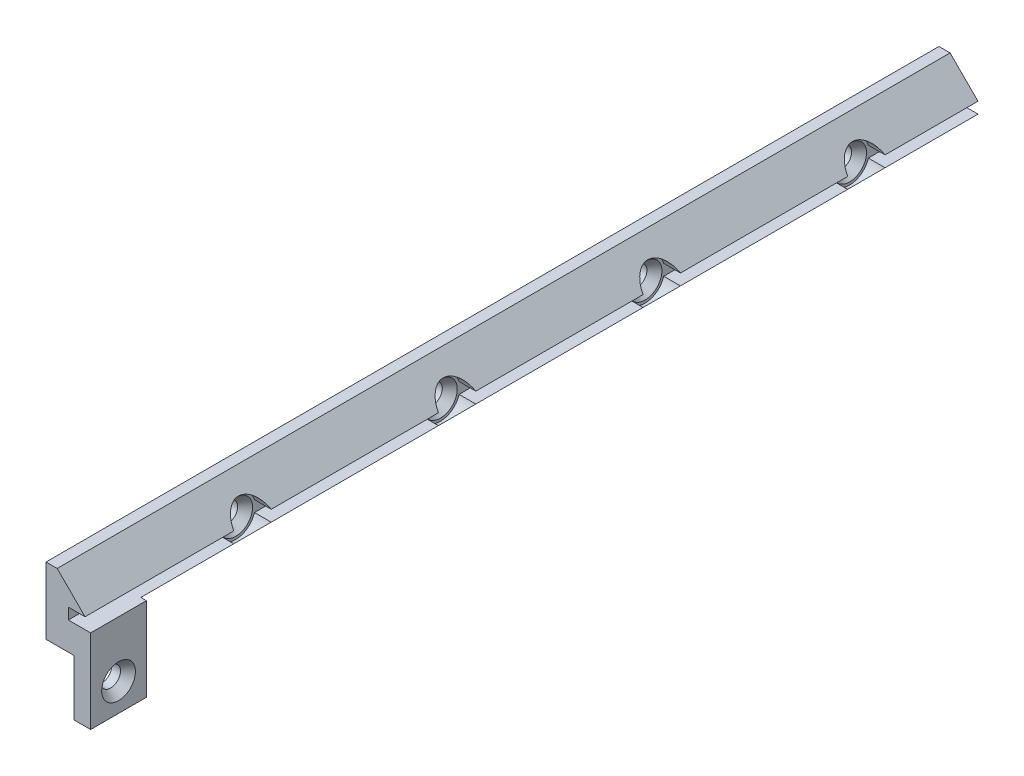
ISO-10303-21;
HEADER;
FILE_DESCRIPTION(('STEP AP214'),'2;1');
FILE_NAME('part.step','',(''),(''),'','','');
FILE_SCHEMA(('AUTOMOTIVE_DESIGN { 1 0 10303 214 1 1 1 1 }'));
ENDSEC;
DATA;
#1=APPLICATION_CONTEXT('core data for automotive mechanical design processes');
#2=APPLICATION_PROTOCOL_DEFINITION('international standard','automotive_design',2000,#1);
#3=PRODUCT_CONTEXT('',#1,'mechanical');
#4=PRODUCT('Part','Part','',(#3));
#5=PRODUCT_RELATED_PRODUCT_CATEGORY('part','',(#4));
#6=PRODUCT_DEFINITION_FORMATION('','',#4);
#7=PRODUCT_DEFINITION_CONTEXT('part definition',#1,'design');
#8=PRODUCT_DEFINITION('design','',#6,#7);
#9=PRODUCT_DEFINITION_SHAPE('','',#8);
#10=(LENGTH_UNIT() NAMED_UNIT(*) SI_UNIT(.MILLI.,.METRE.));
#11=(NAMED_UNIT(*) PLANE_ANGLE_UNIT() SI_UNIT($,.RADIAN.));
#12=(NAMED_UNIT(*) SI_UNIT($,.STERADIAN.) SOLID_ANGLE_UNIT());
#13=UNCERTAINTY_MEASURE_WITH_UNIT(LENGTH_MEASURE(1.E-05),#10,'distance_accuracy_value','');
#14=(GEOMETRIC_REPRESENTATION_CONTEXT(3) GLOBAL_UNCERTAINTY_ASSIGNED_CONTEXT((#13)) GLOBAL_UNIT_ASSIGNED_CONTEXT((#10,
#11,#12)) REPRESENTATION_CONTEXT('',''));
#15=CARTESIAN_POINT('',(0.,0.,0.));
#16=DIRECTION('',(0.,0.,1.));
#17=DIRECTION('',(1.,0.,0.));
#18=AXIS2_PLACEMENT_3D('',#15,#16,#17);
#19=CARTESIAN_POINT('',(2.,-0.5,75.));
#20=DIRECTION('',(0.,-1.,0.));
#21=DIRECTION('',(0.,0.,-1.));
#22=AXIS2_PLACEMENT_3D('',#19,#20,#21);
#23=PLANE('',#22);
#24=DIRECTION('',(1.,0.,0.));
#25=VECTOR('',#24,1.);
#26=CARTESIAN_POINT('',(-4.94974746830583,-0.5,8.32295901687516));
#27=LINE('',#26,#25);
#28=CARTESIAN_POINT('',(0.,-0.5,8.32295901687516));
#29=VERTEX_POINT('',#28);
#30=CARTESIAN_POINT('',(1.49999999999995,-0.5,8.32295901687516));
#31=VERTEX_POINT('',#30);
#32=EDGE_CURVE('E326',#29,#31,#27,.T.);
#33=ORIENTED_EDGE('',*,*,#32,.T.);
#34=DIRECTION('',(0.,0.,1.));
#35=VECTOR('',#34,1.);
#36=CARTESIAN_POINT('',(1.49999999999995,-0.5,75.));
#37=LINE('',#36,#35);
#38=CARTESIAN_POINT('',(1.49999999999995,-0.5,0.));
#39=VERTEX_POINT('',#38);
#40=EDGE_CURVE('E413',#31,#39,#37,.F.);
#41=ORIENTED_EDGE('',*,*,#40,.T.);
#42=DIRECTION('',(-1.,0.,0.));
#43=VECTOR('',#42,1.);
#44=CARTESIAN_POINT('',(2.,-0.5,0.));
#45=LINE('',#44,#43);
#46=CARTESIAN_POINT('',(0.,-0.5,0.));
#47=VERTEX_POINT('',#46);
#48=EDGE_CURVE('E361',#39,#47,#45,.T.);
#49=ORIENTED_EDGE('',*,*,#48,.T.);
#50=DIRECTION('',(0.,0.,-1.));
#51=VECTOR('',#50,1.);
#52=CARTESIAN_POINT('',(0.,-0.5,75.));
#53=LINE('',#52,#51);
#54=EDGE_CURVE('E373',#29,#47,#53,.T.);
#55=ORIENTED_EDGE('',*,*,#54,.F.);
#56=EDGE_LOOP('',(#33,#41,#49,#55));
#57=FACE_BOUND('',#56,.T.);
#58=ADVANCED_FACE('F39',(#57),#23,.F.);
#59=CARTESIAN_POINT('',(2.,0.5,75.));
#60=DIRECTION('',(0.,1.,0.));
#61=DIRECTION('',(-1.,0.,0.));
#62=AXIS2_PLACEMENT_3D('',#59,#60,#61);
#63=PLANE('',#62);
#64=DIRECTION('',(1.,0.,0.));
#65=VECTOR('',#64,1.);
#66=CARTESIAN_POINT('',(-4.94974746830583,0.500000000000001,11.6770609831248));
#67=LINE('',#66,#65);
#68=CARTESIAN_POINT('',(0.,0.500000000000001,11.6770609831248));
#69=VERTEX_POINT('',#68);
#70=CARTESIAN_POINT('',(1.49999999999997,0.500000000000001,11.6770609831248));
#71=VERTEX_POINT('',#70);
#72=EDGE_CURVE('E394',#69,#71,#67,.T.);
#73=ORIENTED_EDGE('',*,*,#72,.T.);
#74=DIRECTION('',(0.,0.,-1.));
#75=VECTOR('',#74,1.);
#76=CARTESIAN_POINT('',(1.49999999999997,0.5,75.));
#77=LINE('',#76,#75);
#78=CARTESIAN_POINT('',(1.49999999999997,0.500000000000001,26.6562890168752));
#79=VERTEX_POINT('',#78);
#80=EDGE_CURVE('E495',#71,#79,#77,.F.);
#81=ORIENTED_EDGE('',*,*,#80,.T.);
#82=DIRECTION('',(1.,0.,0.));
#83=VECTOR('',#82,1.);
#84=CARTESIAN_POINT('',(-4.94974746830583,0.500000000000001,26.6562890168752));
#85=LINE('',#84,#83);
#86=CARTESIAN_POINT('',(0.,0.5,26.6562890168752));
#87=VERTEX_POINT('',#86);
#88=EDGE_CURVE('E387',#79,#87,#85,.F.);
#89=ORIENTED_EDGE('',*,*,#88,.T.);
#90=DIRECTION('',(0.,0.,-1.));
#91=VECTOR('',#90,1.);
#92=CARTESIAN_POINT('',(0.,0.5,75.));
#93=LINE('',#92,#91);
#94=EDGE_CURVE('E557',#87,#69,#93,.T.);
#95=ORIENTED_EDGE('',*,*,#94,.T.);
#96=EDGE_LOOP('',(#73,#81,#89,#95));
#97=FACE_BOUND('',#96,.T.);
#98=ADVANCED_FACE('F554',(#97),#63,.F.);
#99=DIRECTION('',(1.,0.,0.));
#100=VECTOR('',#99,1.);
#101=CARTESIAN_POINT('',(-4.94974746830583,-0.5,26.6562890168752));
#102=LINE('',#101,#100);
#103=CARTESIAN_POINT('',(0.,-0.5,26.6562890168752));
#104=VERTEX_POINT('',#103);
#105=CARTESIAN_POINT('',(1.49999999999995,-0.5,26.6562890168752));
#106=VERTEX_POINT('',#105);
#107=EDGE_CURVE('E335',#104,#106,#102,.T.);
#108=ORIENTED_EDGE('',*,*,#107,.T.);
#109=DIRECTION('',(0.,0.,1.));
#110=VECTOR('',#109,1.);
#111=CARTESIAN_POINT('',(1.49999999999995,-0.5,75.));
#112=LINE('',#111,#110);
#113=CARTESIAN_POINT('',(1.49999999999995,-0.5,11.6770609831248));
#114=VERTEX_POINT('',#113);
#115=EDGE_CURVE('E409',#106,#114,#112,.F.);
#116=ORIENTED_EDGE('',*,*,#115,.T.);
#117=DIRECTION('',(1.,0.,0.));
#118=VECTOR('',#117,1.);
#119=CARTESIAN_POINT('',(-4.94974746830583,-0.5,11.6770609831248));
#120=LINE('',#119,#118);
#121=CARTESIAN_POINT('',(0.,-0.5,11.6770609831248));
#122=VERTEX_POINT('',#121);
#123=EDGE_CURVE('E323',#114,#122,#120,.F.);
#124=ORIENTED_EDGE('',*,*,#123,.T.);
#125=EDGE_CURVE('E531',#104,#122,#53,.T.);
#126=ORIENTED_EDGE('',*,*,#125,.F.);
#127=EDGE_LOOP('',(#108,#116,#124,#126));
#128=FACE_BOUND('',#127,.T.);
#129=ADVANCED_FACE('F585',(#128),#23,.F.);
#130=DIRECTION('',(1.,0.,0.));
#131=VECTOR('',#130,1.);
#132=CARTESIAN_POINT('',(-4.94974746830583,0.500000000000001,30.0103909831248));
#133=LINE('',#132,#131);
#134=CARTESIAN_POINT('',(0.,0.500000000000001,30.0103909831248));
#135=VERTEX_POINT('',#134);
#136=CARTESIAN_POINT('',(1.49999999999997,0.500000000000001,30.0103909831248));
#137=VERTEX_POINT('',#136);
#138=EDGE_CURVE('E389',#135,#137,#133,.T.);
#139=ORIENTED_EDGE('',*,*,#138,.T.);
#140=DIRECTION('',(0.,0.,-1.));
#141=VECTOR('',#140,1.);
#142=CARTESIAN_POINT('',(1.49999999999997,0.5,75.));
#143=LINE('',#142,#141);
#144=CARTESIAN_POINT('',(1.49999999999997,0.500000000000001,44.9896190168752));
#145=VERTEX_POINT('',#144);
#146=EDGE_CURVE('E499',#137,#145,#143,.F.);
#147=ORIENTED_EDGE('',*,*,#146,.T.);
#148=DIRECTION('',(1.,0.,0.));
#149=VECTOR('',#148,1.);
#150=CARTESIAN_POINT('',(-4.94974746830583,0.500000000000001,44.9896190168752));
#151=LINE('',#150,#149);
#152=CARTESIAN_POINT('',(0.,0.5,44.9896190168752));
#153=VERTEX_POINT('',#152);
#154=EDGE_CURVE('E383',#145,#153,#151,.F.);
#155=ORIENTED_EDGE('',*,*,#154,.T.);
#156=EDGE_CURVE('E560',#153,#135,#93,.T.);
#157=ORIENTED_EDGE('',*,*,#156,.T.);
#158=EDGE_LOOP('',(#139,#147,#155,#157));
#159=FACE_BOUND('',#158,.T.);
#160=ADVANCED_FACE('F572',(#159),#63,.F.);
#161=DIRECTION('',(1.,0.,0.));
#162=VECTOR('',#161,1.);
#163=CARTESIAN_POINT('',(-4.94974746830583,-0.5,44.9896190168752));
#164=LINE('',#163,#162);
#165=CARTESIAN_POINT('',(0.,-0.5,44.9896190168752));
#166=VERTEX_POINT('',#165);
#167=CARTESIAN_POINT('',(1.49999999999995,-0.5,44.9896190168752));
#168=VERTEX_POINT('',#167);
#169=EDGE_CURVE('E344',#166,#168,#164,.T.);
#170=ORIENTED_EDGE('',*,*,#169,.T.);
#171=DIRECTION('',(0.,0.,1.));
#172=VECTOR('',#171,1.);
#173=CARTESIAN_POINT('',(1.49999999999995,-0.5,75.));
#174=LINE('',#173,#172);
#175=CARTESIAN_POINT('',(1.49999999999995,-0.5,30.0103909831248));
#176=VERTEX_POINT('',#175);
#177=EDGE_CURVE('E397',#168,#176,#174,.F.);
#178=ORIENTED_EDGE('',*,*,#177,.T.);
#179=DIRECTION('',(1.,0.,0.));
#180=VECTOR('',#179,1.);
#181=CARTESIAN_POINT('',(-4.94974746830583,-0.5,30.0103909831248));
#182=LINE('',#181,#180);
#183=CARTESIAN_POINT('',(0.,-0.5,30.0103909831248));
#184=VERTEX_POINT('',#183);
#185=EDGE_CURVE('E333',#176,#184,#182,.F.);
#186=ORIENTED_EDGE('',*,*,#185,.T.);
#187=EDGE_CURVE('E530',#166,#184,#53,.T.);
#188=ORIENTED_EDGE('',*,*,#187,.F.);
#189=EDGE_LOOP('',(#170,#178,#186,#188));
#190=FACE_BOUND('',#189,.T.);
#191=ADVANCED_FACE('F523',(#190),#23,.F.);
#192=DIRECTION('',(1.,0.,0.));
#193=VECTOR('',#192,1.);
#194=CARTESIAN_POINT('',(-4.94974746830583,0.500000000000001,48.3437209831248));
#195=LINE('',#194,#193);
#196=CARTESIAN_POINT('',(0.,0.500000000000001,48.3437209831248));
#197=VERTEX_POINT('',#196);
#198=CARTESIAN_POINT('',(1.49999999999997,0.500000000000001,48.3437209831248));
#199=VERTEX_POINT('',#198);
#200=EDGE_CURVE('E385',#197,#199,#195,.T.);
#201=ORIENTED_EDGE('',*,*,#200,.T.);
#202=DIRECTION('',(0.,0.,-1.));
#203=VECTOR('',#202,1.);
#204=CARTESIAN_POINT('',(1.49999999999997,0.5,75.));
#205=LINE('',#204,#203);
#206=CARTESIAN_POINT('',(1.49999999999997,0.500000000000001,63.3229490168752));
#207=VERTEX_POINT('',#206);
#208=EDGE_CURVE('E63',#199,#207,#205,.F.);
#209=ORIENTED_EDGE('',*,*,#208,.T.);
#210=DIRECTION('',(1.,0.,0.));
#211=VECTOR('',#210,1.);
#212=CARTESIAN_POINT('',(-4.94974746830583,0.500000000000001,63.3229490168752));
#213=LINE('',#212,#211);
#214=CARTESIAN_POINT('',(0.,0.5,63.3229490168752));
#215=VERTEX_POINT('',#214);
#216=EDGE_CURVE('E379',#207,#215,#213,.F.);
#217=ORIENTED_EDGE('',*,*,#216,.T.);
#218=EDGE_CURVE('E374',#215,#197,#93,.T.);
#219=ORIENTED_EDGE('',*,*,#218,.T.);
#220=EDGE_LOOP('',(#201,#209,#217,#219));
#221=FACE_BOUND('',#220,.T.);
#222=ADVANCED_FACE('F565',(#221),#63,.F.);
#223=DIRECTION('',(1.,0.,0.));
#224=VECTOR('',#223,1.);
#225=CARTESIAN_POINT('',(-4.94974746830583,-0.5,63.3229490168752));
#226=LINE('',#225,#224);
#227=CARTESIAN_POINT('',(0.,-0.499999999999997,63.3229490168752));
#228=VERTEX_POINT('',#227);
#229=CARTESIAN_POINT('',(1.49999999999995,-0.5,63.3229490168752));
#230=VERTEX_POINT('',#229);
#231=EDGE_CURVE('E353',#228,#230,#226,.T.);
#232=ORIENTED_EDGE('',*,*,#231,.T.);
#233=DIRECTION('',(0.,0.,1.));
#234=VECTOR('',#233,1.);
#235=CARTESIAN_POINT('',(1.49999999999995,-0.5,75.));
#236=LINE('',#235,#234);
#237=CARTESIAN_POINT('',(1.49999999999995,-0.5,48.3437209831248));
#238=VERTEX_POINT('',#237);
#239=EDGE_CURVE('E491',#230,#238,#236,.F.);
#240=ORIENTED_EDGE('',*,*,#239,.T.);
#241=DIRECTION('',(1.,0.,0.));
#242=VECTOR('',#241,1.);
#243=CARTESIAN_POINT('',(-4.94974746830583,-0.5,48.3437209831248));
#244=LINE('',#243,#242);
#245=CARTESIAN_POINT('',(0.,-0.5,48.3437209831248));
#246=VERTEX_POINT('',#245);
#247=EDGE_CURVE('E342',#238,#246,#244,.F.);
#248=ORIENTED_EDGE('',*,*,#247,.T.);
#249=EDGE_CURVE('E376',#228,#246,#53,.T.);
#250=ORIENTED_EDGE('',*,*,#249,.F.);
#251=EDGE_LOOP('',(#232,#240,#248,#250));
#252=FACE_BOUND('',#251,.T.);
#253=ADVANCED_FACE('F510',(#252),#23,.F.);
#254=DIRECTION('',(1.,0.,0.));
#255=VECTOR('',#254,1.);
#256=CARTESIAN_POINT('',(-4.94974746830583,0.500000000000001,66.6770509831248));
#257=LINE('',#256,#255);
#258=CARTESIAN_POINT('',(0.,0.499999999999999,66.6770509831248));
#259=VERTEX_POINT('',#258);
#260=CARTESIAN_POINT('',(1.49999999999997,0.500000000000001,66.6770509831248));
#261=VERTEX_POINT('',#260);
#262=EDGE_CURVE('E381',#259,#261,#257,.T.);
#263=ORIENTED_EDGE('',*,*,#262,.T.);
#264=DIRECTION('',(0.,0.,-1.));
#265=VECTOR('',#264,1.);
#266=CARTESIAN_POINT('',(1.49999999999997,0.5,75.));
#267=LINE('',#266,#265);
#268=CARTESIAN_POINT('',(1.49999999999997,0.499999999999999,80.));
#269=VERTEX_POINT('',#268);
#270=EDGE_CURVE('E11',#261,#269,#267,.F.);
#271=ORIENTED_EDGE('',*,*,#270,.T.);
#272=DIRECTION('',(1.,0.,0.));
#273=VECTOR('',#272,1.);
#274=CARTESIAN_POINT('',(0.,0.5,80.));
#275=LINE('',#274,#273);
#276=CARTESIAN_POINT('',(0.,0.5,80.));
#277=VERTEX_POINT('',#276);
#278=EDGE_CURVE('E276',#277,#269,#275,.T.);
#279=ORIENTED_EDGE('',*,*,#278,.F.);
#280=EDGE_CURVE('E370',#277,#259,#93,.T.);
#281=ORIENTED_EDGE('',*,*,#280,.T.);
#282=EDGE_LOOP('',(#263,#271,#279,#281));
#283=FACE_BOUND('',#282,.T.);
#284=ADVANCED_FACE('F476',(#283),#63,.F.);
#285=CARTESIAN_POINT('',(-2.,3.,75.));
#286=DIRECTION('',(0.,-1.,0.));
#287=DIRECTION('',(0.,0.,-1.));
#288=AXIS2_PLACEMENT_3D('',#285,#286,#287);
#289=PLANE('',#288);
#290=DIRECTION('',(0.,0.,-1.));
#291=VECTOR('',#290,1.);
#292=CARTESIAN_POINT('',(-2.,3.,75.));
#293=LINE('',#292,#291);
#294=CARTESIAN_POINT('',(-2.,3.,80.));
#295=VERTEX_POINT('',#294);
#296=CARTESIAN_POINT('',(-2.,3.,0.));
#297=VERTEX_POINT('',#296);
#298=EDGE_CURVE('E237',#295,#297,#293,.T.);
#299=ORIENTED_EDGE('',*,*,#298,.F.);
#300=DIRECTION('',(-1.,0.,0.));
#301=VECTOR('',#300,1.);
#302=CARTESIAN_POINT('',(0.,3.,80.));
#303=LINE('',#302,#301);
#304=CARTESIAN_POINT('',(-1.00000000000005,3.,80.));
#305=VERTEX_POINT('',#304);
#306=EDGE_CURVE('E253',#305,#295,#303,.T.);
#307=ORIENTED_EDGE('',*,*,#306,.F.);
#308=DIRECTION('',(0.,0.,-1.));
#309=VECTOR('',#308,1.);
#310=CARTESIAN_POINT('',(-1.00000000000005,3.,75.));
#311=LINE('',#310,#309);
#312=CARTESIAN_POINT('',(-1.00000000000005,3.,0.));
#313=VERTEX_POINT('',#312);
#314=EDGE_CURVE('E482',#305,#313,#311,.T.);
#315=ORIENTED_EDGE('',*,*,#314,.T.);
#316=DIRECTION('',(-1.,0.,0.));
#317=VECTOR('',#316,1.);
#318=CARTESIAN_POINT('',(-2.,3.,0.));
#319=LINE('',#318,#317);
#320=EDGE_CURVE('E356',#313,#297,#319,.T.);
#321=ORIENTED_EDGE('',*,*,#320,.T.);
#322=EDGE_LOOP('',(#299,#307,#315,#321));
#323=FACE_BOUND('',#322,.T.);
#324=ADVANCED_FACE('F605',(#323),#289,.F.);
#325=CARTESIAN_POINT('',(-2.,-3.,75.));
#326=DIRECTION('',(1.,0.,0.));
#327=DIRECTION('',(0.,0.,-1.));
#328=AXIS2_PLACEMENT_3D('',#325,#326,#327);
#329=PLANE('',#328);
#330=CARTESIAN_POINT('',(-2.,0.,65.));
#331=DIRECTION('',(1.,0.,0.));
#332=DIRECTION('',(0.,0.,-1.));
#333=AXIS2_PLACEMENT_3D('',#330,#331,#332);
#334=CIRCLE('',#333,0.888999999999999);
#335=CARTESIAN_POINT('',(-2.,0.,64.111));
#336=VERTEX_POINT('',#335);
#337=EDGE_CURVE('E298',#336,#336,#334,.T.);
#338=ORIENTED_EDGE('',*,*,#337,.T.);
#339=EDGE_LOOP('',(#338));
#340=FACE_BOUND('',#339,.T.);
#341=CARTESIAN_POINT('',(-2.,0.,10.00001));
#342=DIRECTION('',(1.,0.,0.));
#343=DIRECTION('',(0.,0.,-1.));
#344=AXIS2_PLACEMENT_3D('',#341,#342,#343);
#345=CIRCLE('',#344,0.888999999999999);
#346=CARTESIAN_POINT('',(-2.,0.,9.11101));
#347=VERTEX_POINT('',#346);
#348=EDGE_CURVE('E305',#347,#347,#345,.T.);
#349=ORIENTED_EDGE('',*,*,#348,.T.);
#350=EDGE_LOOP('',(#349));
#351=FACE_BOUND('',#350,.T.);
#352=CARTESIAN_POINT('',(-2.,0.,46.66667));
#353=DIRECTION('',(1.,0.,0.));
#354=DIRECTION('',(0.,0.,-1.));
#355=AXIS2_PLACEMENT_3D('',#352,#353,#354);
#356=CIRCLE('',#355,0.888999999999999);
#357=CARTESIAN_POINT('',(-2.,0.,45.77767));
#358=VERTEX_POINT('',#357);
#359=EDGE_CURVE('E312',#358,#358,#356,.T.);
#360=ORIENTED_EDGE('',*,*,#359,.T.);
#361=EDGE_LOOP('',(#360));
#362=FACE_BOUND('',#361,.T.);
#363=CARTESIAN_POINT('',(-2.,0.,28.33334));
#364=DIRECTION('',(1.,0.,0.));
#365=DIRECTION('',(0.,0.,-1.));
#366=AXIS2_PLACEMENT_3D('',#363,#364,#365);
#367=CIRCLE('',#366,0.888999999999999);
#368=CARTESIAN_POINT('',(-2.,0.,27.44434));
#369=VERTEX_POINT('',#368);
#370=EDGE_CURVE('E319',#369,#369,#367,.T.);
#371=ORIENTED_EDGE('',*,*,#370,.T.);
#372=EDGE_LOOP('',(#371));
#373=FACE_BOUND('',#372,.T.);
#374=DIRECTION('',(0.,-1.,0.));
#375=VECTOR('',#374,1.);
#376=CARTESIAN_POINT('',(-2.,-3.,0.));
#377=LINE('',#376,#375);
#378=CARTESIAN_POINT('',(-2.,-3.,0.));
#379=VERTEX_POINT('',#378);
#380=EDGE_CURVE('E232',#297,#379,#377,.T.);
#381=ORIENTED_EDGE('',*,*,#380,.T.);
#382=DIRECTION('',(0.,0.,-1.));
#383=VECTOR('',#382,1.);
#384=CARTESIAN_POINT('',(-2.,-3.,75.));
#385=LINE('',#384,#383);
#386=CARTESIAN_POINT('',(-2.,-3.,80.));
#387=VERTEX_POINT('',#386);
#388=EDGE_CURVE('E225',#387,#379,#385,.T.);
#389=ORIENTED_EDGE('',*,*,#388,.F.);
#390=DIRECTION('',(0.,-1.,0.));
#391=VECTOR('',#390,1.);
#392=CARTESIAN_POINT('',(-2.,0.,80.));
#393=LINE('',#392,#391);
#394=EDGE_CURVE('E230',#295,#387,#393,.T.);
#395=ORIENTED_EDGE('',*,*,#394,.F.);
#396=ORIENTED_EDGE('',*,*,#298,.T.);
#397=EDGE_LOOP('',(#381,#389,#395,#396));
#398=FACE_BOUND('',#397,.T.);
#399=ADVANCED_FACE('F227',(#340,#351,#362,#373,#398),#329,.F.);
#400=CARTESIAN_POINT('',(-2.,-3.,75.));
#401=DIRECTION('',(0.,1.,0.));
#402=DIRECTION('',(0.,0.,1.));
#403=AXIS2_PLACEMENT_3D('',#400,#401,#402);
#404=PLANE('',#403);
#405=DIRECTION('',(1.,0.,0.));
#406=VECTOR('',#405,1.);
#407=CARTESIAN_POINT('',(-2.,-3.,0.));
#408=LINE('',#407,#406);
#409=CARTESIAN_POINT('',(-1.00000000000002,-3.,0.));
#410=VERTEX_POINT('',#409);
#411=EDGE_CURVE('E359',#379,#410,#408,.T.);
#412=ORIENTED_EDGE('',*,*,#411,.T.);
#413=DIRECTION('',(0.,0.,1.));
#414=VECTOR('',#413,1.);
#415=CARTESIAN_POINT('',(-1.00000000000002,-3.,75.));
#416=LINE('',#415,#414);
#417=CARTESIAN_POINT('',(-1.00000000000002,-3.,75.));
#418=VERTEX_POINT('',#417);
#419=EDGE_CURVE('E419',#410,#418,#416,.T.);
#420=ORIENTED_EDGE('',*,*,#419,.T.);
#421=DIRECTION('',(1.,0.,0.));
#422=VECTOR('',#421,1.);
#423=CARTESIAN_POINT('',(0.,-3.,75.));
#424=LINE('',#423,#422);
#425=CARTESIAN_POINT('',(0.5,-3.,75.));
#426=VERTEX_POINT('',#425);
#427=EDGE_CURVE('E288',#418,#426,#424,.T.);
#428=ORIENTED_EDGE('',*,*,#427,.T.);
#429=DIRECTION('',(0.,0.,-1.));
#430=VECTOR('',#429,1.);
#431=CARTESIAN_POINT('',(0.5,-3.,80.));
#432=LINE('',#431,#430);
#433=CARTESIAN_POINT('',(0.5,-3.,80.));
#434=VERTEX_POINT('',#433);
#435=EDGE_CURVE('E244',#434,#426,#432,.T.);
#436=ORIENTED_EDGE('',*,*,#435,.F.);
#437=DIRECTION('',(1.,0.,0.));
#438=VECTOR('',#437,1.);
#439=CARTESIAN_POINT('',(0.,-3.,80.));
#440=LINE('',#439,#438);
#441=EDGE_CURVE('E241',#387,#434,#440,.T.);
#442=ORIENTED_EDGE('',*,*,#441,.F.);
#443=ORIENTED_EDGE('',*,*,#388,.T.);
#444=EDGE_LOOP('',(#412,#420,#428,#436,#442,#443));
#445=FACE_BOUND('',#444,.T.);
#446=ADVANCED_FACE('F242',(#445),#404,.F.);
#447=CARTESIAN_POINT('',(0.,-0.5,80.));
#448=VERTEX_POINT('',#447);
#449=CARTESIAN_POINT('',(0.,-0.5,66.6770509831248));
#450=VERTEX_POINT('',#449);
#451=EDGE_CURVE('E238',#448,#450,#53,.T.);
#452=ORIENTED_EDGE('',*,*,#451,.F.);
#453=DIRECTION('',(-1.,0.,0.));
#454=VECTOR('',#453,1.);
#455=CARTESIAN_POINT('',(0.,-0.5,80.));
#456=LINE('',#455,#454);
#457=CARTESIAN_POINT('',(2.,-0.5,80.));
#458=VERTEX_POINT('',#457);
#459=EDGE_CURVE('E270',#458,#448,#456,.T.);
#460=ORIENTED_EDGE('',*,*,#459,.F.);
#461=DIRECTION('',(0.,0.,-1.));
#462=VECTOR('',#461,1.);
#463=CARTESIAN_POINT('',(2.,-0.5,80.));
#464=LINE('',#463,#462);
#465=CARTESIAN_POINT('',(2.,-0.5,75.));
#466=VERTEX_POINT('',#465);
#467=EDGE_CURVE('E282',#458,#466,#464,.T.);
#468=ORIENTED_EDGE('',*,*,#467,.T.);
#469=DIRECTION('',(-1.,0.,0.));
#470=VECTOR('',#469,1.);
#471=CARTESIAN_POINT('',(0.,-0.5,75.));
#472=LINE('',#471,#470);
#473=CARTESIAN_POINT('',(1.49999999999995,-0.5,75.));
#474=VERTEX_POINT('',#473);
#475=EDGE_CURVE('E254',#466,#474,#472,.T.);
#476=ORIENTED_EDGE('',*,*,#475,.T.);
#477=DIRECTION('',(0.,0.,1.));
#478=VECTOR('',#477,1.);
#479=CARTESIAN_POINT('',(1.49999999999995,-0.5,75.));
#480=LINE('',#479,#478);
#481=CARTESIAN_POINT('',(1.49999999999995,-0.5,66.6770509831248));
#482=VERTEX_POINT('',#481);
#483=EDGE_CURVE('E429',#474,#482,#480,.F.);
#484=ORIENTED_EDGE('',*,*,#483,.T.);
#485=DIRECTION('',(1.,0.,0.));
#486=VECTOR('',#485,1.);
#487=CARTESIAN_POINT('',(-4.94974746830583,-0.5,66.6770509831248));
#488=LINE('',#487,#486);
#489=EDGE_CURVE('E351',#482,#450,#488,.F.);
#490=ORIENTED_EDGE('',*,*,#489,.T.);
#491=EDGE_LOOP('',(#452,#460,#468,#476,#484,#490));
#492=FACE_BOUND('',#491,.T.);
#493=ADVANCED_FACE('F466',(#492),#23,.F.);
#494=CARTESIAN_POINT('',(0.,0.5,75.));
#495=DIRECTION('',(-1.,0.,0.));
#496=DIRECTION('',(0.,0.,1.));
#497=AXIS2_PLACEMENT_3D('',#494,#495,#496);
#498=PLANE('',#497);
#499=CARTESIAN_POINT('',(0.,0.,65.));
#500=DIRECTION('',(1.,0.,0.));
#501=DIRECTION('',(0.,0.,-1.));
#502=AXIS2_PLACEMENT_3D('',#499,#500,#501);
#503=CIRCLE('',#502,1.5113);
#504=CARTESIAN_POINT('',(0.,0.,63.4887));
#505=VERTEX_POINT('',#504);
#506=EDGE_CURVE('E292',#505,#505,#503,.T.);
#507=ORIENTED_EDGE('',*,*,#506,.F.);
#508=EDGE_LOOP('',(#507));
#509=FACE_BOUND('',#508,.T.);
#510=CARTESIAN_POINT('',(0.,0.,10.00001));
#511=DIRECTION('',(1.,0.,0.));
#512=DIRECTION('',(0.,0.,-1.));
#513=AXIS2_PLACEMENT_3D('',#510,#511,#512);
#514=CIRCLE('',#513,1.5113);
#515=CARTESIAN_POINT('',(0.,0.,8.48871));
#516=VERTEX_POINT('',#515);
#517=EDGE_CURVE('E299',#516,#516,#514,.T.);
#518=ORIENTED_EDGE('',*,*,#517,.F.);
#519=EDGE_LOOP('',(#518));
#520=FACE_BOUND('',#519,.T.);
#521=CARTESIAN_POINT('',(0.,0.,46.66667));
#522=DIRECTION('',(1.,0.,0.));
#523=DIRECTION('',(0.,0.,-1.));
#524=AXIS2_PLACEMENT_3D('',#521,#522,#523);
#525=CIRCLE('',#524,1.5113);
#526=CARTESIAN_POINT('',(0.,0.,45.15537));
#527=VERTEX_POINT('',#526);
#528=EDGE_CURVE('E306',#527,#527,#525,.T.);
#529=ORIENTED_EDGE('',*,*,#528,.F.);
#530=EDGE_LOOP('',(#529));
#531=FACE_BOUND('',#530,.T.);
#532=CARTESIAN_POINT('',(0.,0.,28.33334));
#533=DIRECTION('',(1.,0.,0.));
#534=DIRECTION('',(0.,0.,-1.));
#535=AXIS2_PLACEMENT_3D('',#532,#533,#534);
#536=CIRCLE('',#535,1.5113);
#537=CARTESIAN_POINT('',(0.,0.,26.82204));
#538=VERTEX_POINT('',#537);
#539=EDGE_CURVE('E313',#538,#538,#536,.T.);
#540=ORIENTED_EDGE('',*,*,#539,.F.);
#541=EDGE_LOOP('',(#540));
#542=FACE_BOUND('',#541,.T.);
#543=ORIENTED_EDGE('',*,*,#125,.T.);
#544=CARTESIAN_POINT('',(0.,0.,10.00001));
#545=DIRECTION('',(-1.,0.,0.));
#546=DIRECTION('',(0.,0.,1.));
#547=AXIS2_PLACEMENT_3D('',#544,#545,#546);
#548=CIRCLE('',#547,1.75);
#549=EDGE_CURVE('E320',#122,#29,#548,.F.);
#550=ORIENTED_EDGE('',*,*,#549,.T.);
#551=ORIENTED_EDGE('',*,*,#54,.T.);
#552=DIRECTION('',(0.,1.,0.));
#553=VECTOR('',#552,1.);
#554=CARTESIAN_POINT('',(0.,0.5,0.));
#555=LINE('',#554,#553);
#556=CARTESIAN_POINT('',(0.,0.5,0.));
#557=VERTEX_POINT('',#556);
#558=EDGE_CURVE('E363',#47,#557,#555,.T.);
#559=ORIENTED_EDGE('',*,*,#558,.T.);
#560=CARTESIAN_POINT('',(0.,0.5,8.32295901687516));
#561=VERTEX_POINT('',#560);
#562=EDGE_CURVE('E369',#561,#557,#93,.T.);
#563=ORIENTED_EDGE('',*,*,#562,.F.);
#564=EDGE_CURVE('E324',#561,#69,#548,.F.);
#565=ORIENTED_EDGE('',*,*,#564,.T.);
#566=ORIENTED_EDGE('',*,*,#94,.F.);
#567=CARTESIAN_POINT('',(0.,0.,28.33334));
#568=DIRECTION('',(-1.,0.,0.));
#569=DIRECTION('',(0.,0.,1.));
#570=AXIS2_PLACEMENT_3D('',#567,#568,#569);
#571=CIRCLE('',#570,1.75);
#572=EDGE_CURVE('E329',#87,#135,#571,.F.);
#573=ORIENTED_EDGE('',*,*,#572,.T.);
#574=ORIENTED_EDGE('',*,*,#156,.F.);
#575=CARTESIAN_POINT('',(0.,0.,46.66667));
#576=DIRECTION('',(-1.,0.,0.));
#577=DIRECTION('',(0.,0.,1.));
#578=AXIS2_PLACEMENT_3D('',#575,#576,#577);
#579=CIRCLE('',#578,1.75);
#580=EDGE_CURVE('E338',#153,#197,#579,.F.);
#581=ORIENTED_EDGE('',*,*,#580,.T.);
#582=ORIENTED_EDGE('',*,*,#218,.F.);
#583=CARTESIAN_POINT('',(0.,0.,65.));
#584=DIRECTION('',(-1.,0.,0.));
#585=DIRECTION('',(0.,0.,1.));
#586=AXIS2_PLACEMENT_3D('',#583,#584,#585);
#587=CIRCLE('',#586,1.75);
#588=EDGE_CURVE('E347',#215,#259,#587,.F.);
#589=ORIENTED_EDGE('',*,*,#588,.T.);
#590=ORIENTED_EDGE('',*,*,#280,.F.);
#591=DIRECTION('',(0.,1.,0.));
#592=VECTOR('',#591,1.);
#593=CARTESIAN_POINT('',(0.,0.,80.));
#594=LINE('',#593,#592);
#595=EDGE_CURVE('E273',#448,#277,#594,.T.);
#596=ORIENTED_EDGE('',*,*,#595,.F.);
#597=ORIENTED_EDGE('',*,*,#451,.T.);
#598=EDGE_CURVE('E348',#450,#228,#587,.F.);
#599=ORIENTED_EDGE('',*,*,#598,.T.);
#600=ORIENTED_EDGE('',*,*,#249,.T.);
#601=EDGE_CURVE('E339',#246,#166,#579,.F.);
#602=ORIENTED_EDGE('',*,*,#601,.T.);
#603=ORIENTED_EDGE('',*,*,#187,.T.);
#604=EDGE_CURVE('E330',#184,#104,#571,.F.);
#605=ORIENTED_EDGE('',*,*,#604,.T.);
#606=EDGE_LOOP('',(#543,#550,#551,#559,#563,#565,#566,#573,#574,#581,#582,#589,#590,#596,#597,
#599,#600,#602,#603,#605));
#607=FACE_BOUND('',#606,.T.);
#608=ADVANCED_FACE('F471',(#509,#520,#531,#542,#607),#498,.F.);
#609=DIRECTION('',(1.,0.,0.));
#610=VECTOR('',#609,1.);
#611=CARTESIAN_POINT('',(2.,0.5,0.));
#612=LINE('',#611,#610);
#613=CARTESIAN_POINT('',(1.49999999999997,0.5,0.));
#614=VERTEX_POINT('',#613);
#615=EDGE_CURVE('E366',#557,#614,#612,.T.);
#616=ORIENTED_EDGE('',*,*,#615,.T.);
#617=DIRECTION('',(0.,0.,-1.));
#618=VECTOR('',#617,1.);
#619=CARTESIAN_POINT('',(1.49999999999997,0.5,75.));
#620=LINE('',#619,#618);
#621=CARTESIAN_POINT('',(1.49999999999997,0.500000000000001,8.32295901687516));
#622=VERTEX_POINT('',#621);
#623=EDGE_CURVE('E486',#614,#622,#620,.F.);
#624=ORIENTED_EDGE('',*,*,#623,.T.);
#625=DIRECTION('',(1.,0.,0.));
#626=VECTOR('',#625,1.);
#627=CARTESIAN_POINT('',(-4.94974746830583,0.500000000000001,8.32295901687516));
#628=LINE('',#627,#626);
#629=EDGE_CURVE('E392',#622,#561,#628,.F.);
#630=ORIENTED_EDGE('',*,*,#629,.T.);
#631=ORIENTED_EDGE('',*,*,#562,.T.);
#632=EDGE_LOOP('',(#616,#624,#630,#631));
#633=FACE_BOUND('',#632,.T.);
#634=ADVANCED_FACE('F543',(#633),#63,.F.);
#635=CARTESIAN_POINT('',(0.,0.,0.));
#636=DIRECTION('',(0.,0.,-1.));
#637=DIRECTION('',(-1.,0.,0.));
#638=AXIS2_PLACEMENT_3D('',#635,#636,#637);
#639=PLANE('',#638);
#640=ORIENTED_EDGE('',*,*,#48,.F.);
#641=DIRECTION('',(0.707106781186544,0.707106781186551,0.));
#642=VECTOR('',#641,1.);
#643=CARTESIAN_POINT('',(0.999999999999984,-0.999999999999973,0.));
#644=LINE('',#643,#642);
#645=EDGE_CURVE('E417',#39,#410,#644,.F.);
#646=ORIENTED_EDGE('',*,*,#645,.T.);
#647=ORIENTED_EDGE('',*,*,#411,.F.);
#648=ORIENTED_EDGE('',*,*,#380,.F.);
#649=ORIENTED_EDGE('',*,*,#320,.F.);
#650=DIRECTION('',(-0.707106781186551,0.707106781186544,0.));
#651=VECTOR('',#650,1.);
#652=CARTESIAN_POINT('',(0.999999999999979,0.999999999999989,0.));
#653=LINE('',#652,#651);
#654=EDGE_CURVE('E415',#313,#614,#653,.F.);
#655=ORIENTED_EDGE('',*,*,#654,.T.);
#656=ORIENTED_EDGE('',*,*,#615,.F.);
#657=ORIENTED_EDGE('',*,*,#558,.F.);
#658=EDGE_LOOP('',(#640,#646,#647,#648,#649,#655,#656,#657));
#659=FACE_BOUND('',#658,.T.);
#660=ADVANCED_FACE('F541',(#659),#639,.T.);
#661=CARTESIAN_POINT('',(-4.94974746830583,0.,65.));
#662=DIRECTION('',(1.,0.,0.));
#663=DIRECTION('',(0.,0.,-1.));
#664=AXIS2_PLACEMENT_3D('',#661,#662,#663);
#665=CYLINDRICAL_SURFACE('',#664,1.75);
#666=ORIENTED_EDGE('',*,*,#216,.F.);
#667=CARTESIAN_POINT('',(1.99999999999998,0.,65.));
#668=DIRECTION('',(-0.707106781186544,-0.707106781186551,0.));
#669=DIRECTION('',(0.707106781186551,-0.707106781186544,0.));
#670=AXIS2_PLACEMENT_3D('',#667,#668,#669);
#671=ELLIPSE('',#670,2.47487373415292,1.75);
#672=EDGE_CURVE('E48',#207,#261,#671,.F.);
#673=ORIENTED_EDGE('',*,*,#672,.T.);
#674=ORIENTED_EDGE('',*,*,#262,.F.);
#675=ORIENTED_EDGE('',*,*,#588,.F.);
#676=EDGE_LOOP('',(#666,#673,#674,#675));
#677=FACE_BOUND('',#676,.T.);
#678=ADVANCED_FACE('F616',(#677),#665,.F.);
#679=ORIENTED_EDGE('',*,*,#489,.F.);
#680=CARTESIAN_POINT('',(1.99999999999995,0.,65.));
#681=DIRECTION('',(-0.707106781186551,0.707106781186544,0.));
#682=DIRECTION('',(0.707106781186544,0.707106781186551,0.));
#683=AXIS2_PLACEMENT_3D('',#680,#681,#682);
#684=ELLIPSE('',#683,2.4748737341529,1.75);
#685=EDGE_CURVE('E422',#482,#230,#684,.F.);
#686=ORIENTED_EDGE('',*,*,#685,.T.);
#687=ORIENTED_EDGE('',*,*,#231,.F.);
#688=ORIENTED_EDGE('',*,*,#598,.F.);
#689=EDGE_LOOP('',(#679,#686,#687,#688));
#690=FACE_BOUND('',#689,.T.);
#691=ADVANCED_FACE('F617',(#690),#665,.F.);
#692=CARTESIAN_POINT('',(-4.94974746830583,0.,46.66667));
#693=DIRECTION('',(1.,0.,0.));
#694=DIRECTION('',(0.,0.,-1.));
#695=AXIS2_PLACEMENT_3D('',#692,#693,#694);
#696=CYLINDRICAL_SURFACE('',#695,1.75);
#697=ORIENTED_EDGE('',*,*,#154,.F.);
#698=CARTESIAN_POINT('',(1.99999999999998,0.,46.66667));
#699=DIRECTION('',(-0.707106781186544,-0.707106781186551,0.));
#700=DIRECTION('',(0.707106781186551,-0.707106781186544,0.));
#701=AXIS2_PLACEMENT_3D('',#698,#699,#700);
#702=ELLIPSE('',#701,2.47487373415292,1.75);
#703=EDGE_CURVE('E501',#145,#199,#702,.F.);
#704=ORIENTED_EDGE('',*,*,#703,.T.);
#705=ORIENTED_EDGE('',*,*,#200,.F.);
#706=ORIENTED_EDGE('',*,*,#580,.F.);
#707=EDGE_LOOP('',(#697,#704,#705,#706));
#708=FACE_BOUND('',#707,.T.);
#709=ADVANCED_FACE('F570',(#708),#696,.F.);
#710=ORIENTED_EDGE('',*,*,#247,.F.);
#711=CARTESIAN_POINT('',(1.99999999999995,0.,46.66667));
#712=DIRECTION('',(-0.707106781186551,0.707106781186544,0.));
#713=DIRECTION('',(0.707106781186544,0.707106781186551,0.));
#714=AXIS2_PLACEMENT_3D('',#711,#712,#713);
#715=ELLIPSE('',#714,2.4748737341529,1.75);
#716=EDGE_CURVE('E487',#238,#168,#715,.F.);
#717=ORIENTED_EDGE('',*,*,#716,.T.);
#718=ORIENTED_EDGE('',*,*,#169,.F.);
#719=ORIENTED_EDGE('',*,*,#601,.F.);
#720=EDGE_LOOP('',(#710,#717,#718,#719));
#721=FACE_BOUND('',#720,.T.);
#722=ADVANCED_FACE('F515',(#721),#696,.F.);
#723=CARTESIAN_POINT('',(-4.94974746830583,0.,28.33334));
#724=DIRECTION('',(1.,0.,0.));
#725=DIRECTION('',(0.,0.,-1.));
#726=AXIS2_PLACEMENT_3D('',#723,#724,#725);
#727=CYLINDRICAL_SURFACE('',#726,1.75);
#728=ORIENTED_EDGE('',*,*,#88,.F.);
#729=CARTESIAN_POINT('',(1.99999999999998,0.,28.33334));
#730=DIRECTION('',(-0.707106781186544,-0.707106781186551,0.));
#731=DIRECTION('',(0.707106781186551,-0.707106781186544,0.));
#732=AXIS2_PLACEMENT_3D('',#729,#730,#731);
#733=ELLIPSE('',#732,2.47487373415292,1.75);
#734=EDGE_CURVE('E497',#79,#137,#733,.F.);
#735=ORIENTED_EDGE('',*,*,#734,.T.);
#736=ORIENTED_EDGE('',*,*,#138,.F.);
#737=ORIENTED_EDGE('',*,*,#572,.F.);
#738=EDGE_LOOP('',(#728,#735,#736,#737));
#739=FACE_BOUND('',#738,.T.);
#740=ADVANCED_FACE('F574',(#739),#727,.F.);
#741=ORIENTED_EDGE('',*,*,#185,.F.);
#742=CARTESIAN_POINT('',(1.99999999999995,0.,28.33334));
#743=DIRECTION('',(-0.707106781186551,0.707106781186544,0.));
#744=DIRECTION('',(0.707106781186544,0.707106781186551,0.));
#745=AXIS2_PLACEMENT_3D('',#742,#743,#744);
#746=ELLIPSE('',#745,2.4748737341529,1.75);
#747=EDGE_CURVE('E407',#176,#106,#746,.F.);
#748=ORIENTED_EDGE('',*,*,#747,.T.);
#749=ORIENTED_EDGE('',*,*,#107,.F.);
#750=ORIENTED_EDGE('',*,*,#604,.F.);
#751=EDGE_LOOP('',(#741,#748,#749,#750));
#752=FACE_BOUND('',#751,.T.);
#753=ADVANCED_FACE('F527',(#752),#727,.F.);
#754=CARTESIAN_POINT('',(-4.94974746830583,0.,10.00001));
#755=DIRECTION('',(1.,0.,0.));
#756=DIRECTION('',(0.,0.,-1.));
#757=AXIS2_PLACEMENT_3D('',#754,#755,#756);
#758=CYLINDRICAL_SURFACE('',#757,1.75);
#759=ORIENTED_EDGE('',*,*,#629,.F.);
#760=CARTESIAN_POINT('',(1.99999999999998,0.,10.00001));
#761=DIRECTION('',(-0.707106781186544,-0.707106781186551,0.));
#762=DIRECTION('',(0.707106781186551,-0.707106781186544,0.));
#763=AXIS2_PLACEMENT_3D('',#760,#761,#762);
#764=ELLIPSE('',#763,2.47487373415292,1.75);
#765=EDGE_CURVE('E489',#622,#71,#764,.F.);
#766=ORIENTED_EDGE('',*,*,#765,.T.);
#767=ORIENTED_EDGE('',*,*,#72,.F.);
#768=ORIENTED_EDGE('',*,*,#564,.F.);
#769=EDGE_LOOP('',(#759,#766,#767,#768));
#770=FACE_BOUND('',#769,.T.);
#771=ADVANCED_FACE('F549',(#770),#758,.F.);
#772=ORIENTED_EDGE('',*,*,#123,.F.);
#773=CARTESIAN_POINT('',(1.99999999999995,0.,10.00001));
#774=DIRECTION('',(-0.707106781186551,0.707106781186544,0.));
#775=DIRECTION('',(0.707106781186544,0.707106781186551,0.));
#776=AXIS2_PLACEMENT_3D('',#773,#774,#775);
#777=ELLIPSE('',#776,2.4748737341529,1.75);
#778=EDGE_CURVE('E411',#114,#31,#777,.F.);
#779=ORIENTED_EDGE('',*,*,#778,.T.);
#780=ORIENTED_EDGE('',*,*,#32,.F.);
#781=ORIENTED_EDGE('',*,*,#549,.F.);
#782=EDGE_LOOP('',(#772,#779,#780,#781));
#783=FACE_BOUND('',#782,.T.);
#784=ADVANCED_FACE('F764',(#783),#758,.F.);
#785=CARTESIAN_POINT('',(0.,0.,28.33334));
#786=DIRECTION('',(1.,0.,0.));
#787=DIRECTION('',(0.,0.,-1.));
#788=AXIS2_PLACEMENT_3D('',#785,#786,#787);
#789=CYLINDRICAL_SURFACE('',#788,0.888999999999999);
#790=CARTESIAN_POINT('',(-0.715874259813634,0.,28.33334));
#791=DIRECTION('',(1.,0.,0.));
#792=DIRECTION('',(0.,0.,-1.));
#793=AXIS2_PLACEMENT_3D('',#790,#791,#792);
#794=CIRCLE('',#793,0.888999999999999);
#795=CARTESIAN_POINT('',(-0.715874259813634,0.,27.44434));
#796=VERTEX_POINT('',#795);
#797=EDGE_CURVE('E316',#796,#796,#794,.T.);
#798=ORIENTED_EDGE('',*,*,#797,.T.);
#799=EDGE_LOOP('',(#798));
#800=FACE_BOUND('',#799,.T.);
#801=ORIENTED_EDGE('',*,*,#370,.F.);
#802=EDGE_LOOP('',(#801));
#803=FACE_BOUND('',#802,.T.);
#804=ADVANCED_FACE('F761',(#800,#803),#789,.F.);
#805=CARTESIAN_POINT('',(0.,0.,28.33334));
#806=DIRECTION('',(1.,0.,0.));
#807=DIRECTION('',(0.,0.,-1.));
#808=AXIS2_PLACEMENT_3D('',#805,#806,#807);
#809=CONICAL_SURFACE('',#808,1.5113,0.715584993317676);
#810=ORIENTED_EDGE('',*,*,#797,.F.);
#811=EDGE_LOOP('',(#810));
#812=FACE_BOUND('',#811,.T.);
#813=ORIENTED_EDGE('',*,*,#539,.T.);
#814=EDGE_LOOP('',(#813));
#815=FACE_BOUND('',#814,.T.);
#816=ADVANCED_FACE('F757',(#812,#815),#809,.F.);
#817=CARTESIAN_POINT('',(0.,0.,46.66667));
#818=DIRECTION('',(1.,0.,0.));
#819=DIRECTION('',(0.,0.,-1.));
#820=AXIS2_PLACEMENT_3D('',#817,#818,#819);
#821=CYLINDRICAL_SURFACE('',#820,0.888999999999999);
#822=CARTESIAN_POINT('',(-0.715874259813634,0.,46.66667));
#823=DIRECTION('',(1.,0.,0.));
#824=DIRECTION('',(0.,0.,-1.));
#825=AXIS2_PLACEMENT_3D('',#822,#823,#824);
#826=CIRCLE('',#825,0.888999999999999);
#827=CARTESIAN_POINT('',(-0.715874259813634,0.,45.77767));
#828=VERTEX_POINT('',#827);
#829=EDGE_CURVE('E309',#828,#828,#826,.T.);
#830=ORIENTED_EDGE('',*,*,#829,.T.);
#831=EDGE_LOOP('',(#830));
#832=FACE_BOUND('',#831,.T.);
#833=ORIENTED_EDGE('',*,*,#359,.F.);
#834=EDGE_LOOP('',(#833));
#835=FACE_BOUND('',#834,.T.);
#836=ADVANCED_FACE('F753',(#832,#835),#821,.F.);
#837=CARTESIAN_POINT('',(0.,0.,46.66667));
#838=DIRECTION('',(1.,0.,0.));
#839=DIRECTION('',(0.,0.,-1.));
#840=AXIS2_PLACEMENT_3D('',#837,#838,#839);
#841=CONICAL_SURFACE('',#840,1.5113,0.715584993317676);
#842=ORIENTED_EDGE('',*,*,#829,.F.);
#843=EDGE_LOOP('',(#842));
#844=FACE_BOUND('',#843,.T.);
#845=ORIENTED_EDGE('',*,*,#528,.T.);
#846=EDGE_LOOP('',(#845));
#847=FACE_BOUND('',#846,.T.);
#848=ADVANCED_FACE('F749',(#844,#847),#841,.F.);
#849=CARTESIAN_POINT('',(0.,0.,10.00001));
#850=DIRECTION('',(1.,0.,0.));
#851=DIRECTION('',(0.,0.,-1.));
#852=AXIS2_PLACEMENT_3D('',#849,#850,#851);
#853=CYLINDRICAL_SURFACE('',#852,0.888999999999999);
#854=CARTESIAN_POINT('',(-0.715874259813634,0.,10.00001));
#855=DIRECTION('',(1.,0.,0.));
#856=DIRECTION('',(0.,0.,-1.));
#857=AXIS2_PLACEMENT_3D('',#854,#855,#856);
#858=CIRCLE('',#857,0.888999999999999);
#859=CARTESIAN_POINT('',(-0.715874259813634,0.,9.11101));
#860=VERTEX_POINT('',#859);
#861=EDGE_CURVE('E302',#860,#860,#858,.T.);
#862=ORIENTED_EDGE('',*,*,#861,.T.);
#863=EDGE_LOOP('',(#862));
#864=FACE_BOUND('',#863,.T.);
#865=ORIENTED_EDGE('',*,*,#348,.F.);
#866=EDGE_LOOP('',(#865));
#867=FACE_BOUND('',#866,.T.);
#868=ADVANCED_FACE('F745',(#864,#867),#853,.F.);
#869=CARTESIAN_POINT('',(0.,0.,10.00001));
#870=DIRECTION('',(1.,0.,0.));
#871=DIRECTION('',(0.,0.,-1.));
#872=AXIS2_PLACEMENT_3D('',#869,#870,#871);
#873=CONICAL_SURFACE('',#872,1.5113,0.715584993317676);
#874=ORIENTED_EDGE('',*,*,#861,.F.);
#875=EDGE_LOOP('',(#874));
#876=FACE_BOUND('',#875,.T.);
#877=ORIENTED_EDGE('',*,*,#517,.T.);
#878=EDGE_LOOP('',(#877));
#879=FACE_BOUND('',#878,.T.);
#880=ADVANCED_FACE('F741',(#876,#879),#873,.F.);
#881=CARTESIAN_POINT('',(0.,0.,65.));
#882=DIRECTION('',(1.,0.,0.));
#883=DIRECTION('',(0.,0.,-1.));
#884=AXIS2_PLACEMENT_3D('',#881,#882,#883);
#885=CYLINDRICAL_SURFACE('',#884,0.888999999999999);
#886=CARTESIAN_POINT('',(-0.715874259813634,0.,65.));
#887=DIRECTION('',(1.,0.,0.));
#888=DIRECTION('',(0.,0.,-1.));
#889=AXIS2_PLACEMENT_3D('',#886,#887,#888);
#890=CIRCLE('',#889,0.888999999999999);
#891=CARTESIAN_POINT('',(-0.715874259813634,0.,64.111));
#892=VERTEX_POINT('',#891);
#893=EDGE_CURVE('E295',#892,#892,#890,.T.);
#894=ORIENTED_EDGE('',*,*,#893,.T.);
#895=EDGE_LOOP('',(#894));
#896=FACE_BOUND('',#895,.T.);
#897=ORIENTED_EDGE('',*,*,#337,.F.);
#898=EDGE_LOOP('',(#897));
#899=FACE_BOUND('',#898,.T.);
#900=ADVANCED_FACE('F737',(#896,#899),#885,.F.);
#901=CARTESIAN_POINT('',(0.,0.,65.));
#902=DIRECTION('',(1.,0.,0.));
#903=DIRECTION('',(0.,0.,-1.));
#904=AXIS2_PLACEMENT_3D('',#901,#902,#903);
#905=CONICAL_SURFACE('',#904,1.5113,0.715584993317676);
#906=ORIENTED_EDGE('',*,*,#893,.F.);
#907=EDGE_LOOP('',(#906));
#908=FACE_BOUND('',#907,.T.);
#909=ORIENTED_EDGE('',*,*,#506,.T.);
#910=EDGE_LOOP('',(#909));
#911=FACE_BOUND('',#910,.T.);
#912=ADVANCED_FACE('F653',(#908,#911),#905,.F.);
#913=CARTESIAN_POINT('',(2.,0.,75.));
#914=DIRECTION('',(-0.707106781186551,0.707106781186544,0.));
#915=DIRECTION('',(0.,0.,-1.));
#916=AXIS2_PLACEMENT_3D('',#913,#914,#915);
#917=PLANE('',#916);
#918=DIRECTION('',(-0.707106781186544,-0.707106781186551,0.));
#919=VECTOR('',#918,1.);
#920=CARTESIAN_POINT('',(2.,0.,75.));
#921=LINE('',#920,#919);
#922=EDGE_CURVE('E425',#418,#474,#921,.F.);
#923=ORIENTED_EDGE('',*,*,#922,.F.);
#924=ORIENTED_EDGE('',*,*,#419,.F.);
#925=ORIENTED_EDGE('',*,*,#645,.F.);
#926=ORIENTED_EDGE('',*,*,#40,.F.);
#927=ORIENTED_EDGE('',*,*,#778,.F.);
#928=ORIENTED_EDGE('',*,*,#115,.F.);
#929=ORIENTED_EDGE('',*,*,#747,.F.);
#930=ORIENTED_EDGE('',*,*,#177,.F.);
#931=ORIENTED_EDGE('',*,*,#716,.F.);
#932=ORIENTED_EDGE('',*,*,#239,.F.);
#933=ORIENTED_EDGE('',*,*,#685,.F.);
#934=ORIENTED_EDGE('',*,*,#483,.F.);
#935=EDGE_LOOP('',(#923,#924,#925,#926,#927,#928,#929,#930,#931,#932,#933,#934));
#936=FACE_BOUND('',#935,.T.);
#937=ADVANCED_FACE('F518',(#936),#917,.F.);
#938=CARTESIAN_POINT('',(-1.00000000000005,3.,75.));
#939=DIRECTION('',(-0.707106781186544,-0.707106781186551,0.));
#940=DIRECTION('',(0.,0.,-1.));
#941=AXIS2_PLACEMENT_3D('',#938,#939,#940);
#942=PLANE('',#941);
#943=ORIENTED_EDGE('',*,*,#703,.F.);
#944=ORIENTED_EDGE('',*,*,#146,.F.);
#945=ORIENTED_EDGE('',*,*,#734,.F.);
#946=ORIENTED_EDGE('',*,*,#80,.F.);
#947=ORIENTED_EDGE('',*,*,#765,.F.);
#948=ORIENTED_EDGE('',*,*,#623,.F.);
#949=ORIENTED_EDGE('',*,*,#654,.F.);
#950=ORIENTED_EDGE('',*,*,#314,.F.);
#951=DIRECTION('',(-0.707106781186551,0.707106781186544,0.));
#952=VECTOR('',#951,1.);
#953=CARTESIAN_POINT('',(0.999999999999978,0.999999999999989,80.));
#954=LINE('',#953,#952);
#955=EDGE_CURVE('E279',#269,#305,#954,.T.);
#956=ORIENTED_EDGE('',*,*,#955,.F.);
#957=ORIENTED_EDGE('',*,*,#270,.F.);
#958=ORIENTED_EDGE('',*,*,#672,.F.);
#959=ORIENTED_EDGE('',*,*,#208,.F.);
#960=EDGE_LOOP('',(#943,#944,#945,#946,#947,#948,#949,#950,#956,#957,#958,#959));
#961=FACE_BOUND('',#960,.T.);
#962=ADVANCED_FACE('F41',(#961),#942,.F.);
#963=CARTESIAN_POINT('',(0.,0.,75.));
#964=DIRECTION('',(0.,0.,1.));
#965=DIRECTION('',(1.,0.,0.));
#966=AXIS2_PLACEMENT_3D('',#963,#964,#965);
#967=PLANE('',#966);
#968=ORIENTED_EDGE('',*,*,#427,.F.);
#969=ORIENTED_EDGE('',*,*,#922,.T.);
#970=ORIENTED_EDGE('',*,*,#475,.F.);
#971=DIRECTION('',(0.,-1.,0.));
#972=VECTOR('',#971,1.);
#973=CARTESIAN_POINT('',(2.,0.,75.));
#974=LINE('',#973,#972);
#975=CARTESIAN_POINT('',(2.,-8.,75.));
#976=VERTEX_POINT('',#975);
#977=EDGE_CURVE('E257',#466,#976,#974,.T.);
#978=ORIENTED_EDGE('',*,*,#977,.T.);
#979=DIRECTION('',(-1.,0.,0.));
#980=VECTOR('',#979,1.);
#981=CARTESIAN_POINT('',(0.,-8.,75.));
#982=LINE('',#981,#980);
#983=CARTESIAN_POINT('',(0.5,-8.,75.));
#984=VERTEX_POINT('',#983);
#985=EDGE_CURVE('E447',#976,#984,#982,.T.);
#986=ORIENTED_EDGE('',*,*,#985,.T.);
#987=DIRECTION('',(0.,-1.,0.));
#988=VECTOR('',#987,1.);
#989=CARTESIAN_POINT('',(0.499999999999999,0.,75.));
#990=LINE('',#989,#988);
#991=EDGE_CURVE('E285',#426,#984,#990,.T.);
#992=ORIENTED_EDGE('',*,*,#991,.F.);
#993=EDGE_LOOP('',(#968,#969,#970,#978,#986,#992));
#994=FACE_BOUND('',#993,.T.);
#995=ADVANCED_FACE('F441',(#994),#967,.F.);
#996=CARTESIAN_POINT('',(0.499999999999999,0.,80.));
#997=DIRECTION('',(1.,0.,0.));
#998=DIRECTION('',(0.,1.,0.));
#999=AXIS2_PLACEMENT_3D('',#996,#997,#998);
#1000=PLANE('',#999);
#1001=CARTESIAN_POINT('',(0.5,-5.5,77.5));
#1002=DIRECTION('',(1.,0.,0.));
#1003=DIRECTION('',(0.,1.,0.));
#1004=AXIS2_PLACEMENT_3D('',#1001,#1002,#1003);
#1005=CIRCLE('',#1004,0.888999999999993);
#1006=CARTESIAN_POINT('',(0.5,-4.61100000000001,77.5));
#1007=VERTEX_POINT('',#1006);
#1008=EDGE_CURVE('E43',#1007,#1007,#1005,.T.);
#1009=ORIENTED_EDGE('',*,*,#1008,.T.);
#1010=EDGE_LOOP('',(#1009));
#1011=FACE_BOUND('',#1010,.T.);
#1012=ORIENTED_EDGE('',*,*,#991,.T.);
#1013=DIRECTION('',(0.,0.,-1.));
#1014=VECTOR('',#1013,1.);
#1015=CARTESIAN_POINT('',(0.5,-8.,80.));
#1016=LINE('',#1015,#1014);
#1017=CARTESIAN_POINT('',(0.5,-8.,80.));
#1018=VERTEX_POINT('',#1017);
#1019=EDGE_CURVE('E456',#1018,#984,#1016,.T.);
#1020=ORIENTED_EDGE('',*,*,#1019,.F.);
#1021=DIRECTION('',(0.,-1.,0.));
#1022=VECTOR('',#1021,1.);
#1023=CARTESIAN_POINT('',(0.499999999999999,0.,80.));
#1024=LINE('',#1023,#1022);
#1025=EDGE_CURVE('E247',#434,#1018,#1024,.T.);
#1026=ORIENTED_EDGE('',*,*,#1025,.F.);
#1027=ORIENTED_EDGE('',*,*,#435,.T.);
#1028=EDGE_LOOP('',(#1012,#1020,#1026,#1027));
#1029=FACE_BOUND('',#1028,.T.);
#1030=ADVANCED_FACE('F457',(#1011,#1029),#1000,.F.);
#1031=CARTESIAN_POINT('',(0.,-8.,80.));
#1032=DIRECTION('',(0.,-1.,0.));
#1033=DIRECTION('',(0.,0.,-1.));
#1034=AXIS2_PLACEMENT_3D('',#1031,#1032,#1033);
#1035=PLANE('',#1034);
#1036=ORIENTED_EDGE('',*,*,#985,.F.);
#1037=DIRECTION('',(0.,0.,-1.));
#1038=VECTOR('',#1037,1.);
#1039=CARTESIAN_POINT('',(2.,-8.,80.));
#1040=LINE('',#1039,#1038);
#1041=CARTESIAN_POINT('',(2.,-8.,80.));
#1042=VERTEX_POINT('',#1041);
#1043=EDGE_CURVE('E454',#1042,#976,#1040,.T.);
#1044=ORIENTED_EDGE('',*,*,#1043,.F.);
#1045=DIRECTION('',(-1.,0.,0.));
#1046=VECTOR('',#1045,1.);
#1047=CARTESIAN_POINT('',(0.,-8.,80.));
#1048=LINE('',#1047,#1046);
#1049=EDGE_CURVE('E264',#1042,#1018,#1048,.T.);
#1050=ORIENTED_EDGE('',*,*,#1049,.T.);
#1051=ORIENTED_EDGE('',*,*,#1019,.T.);
#1052=EDGE_LOOP('',(#1036,#1044,#1050,#1051));
#1053=FACE_BOUND('',#1052,.T.);
#1054=ADVANCED_FACE('F677',(#1053),#1035,.T.);
#1055=CARTESIAN_POINT('',(2.,0.,80.));
#1056=DIRECTION('',(1.,0.,0.));
#1057=DIRECTION('',(0.,1.,0.));
#1058=AXIS2_PLACEMENT_3D('',#1055,#1056,#1057);
#1059=PLANE('',#1058);
#1060=CARTESIAN_POINT('',(2.,-5.5,77.5));
#1061=DIRECTION('',(1.,0.,0.));
#1062=DIRECTION('',(0.,0.,-1.));
#1063=AXIS2_PLACEMENT_3D('',#1060,#1061,#1062);
#1064=CIRCLE('',#1063,1.5113);
#1065=CARTESIAN_POINT('',(2.,-5.5,75.9887));
#1066=VERTEX_POINT('',#1065);
#1067=EDGE_CURVE('E1000',#1066,#1066,#1064,.T.);
#1068=ORIENTED_EDGE('',*,*,#1067,.F.);
#1069=EDGE_LOOP('',(#1068));
#1070=FACE_BOUND('',#1069,.T.);
#1071=ORIENTED_EDGE('',*,*,#977,.F.);
#1072=ORIENTED_EDGE('',*,*,#467,.F.);
#1073=DIRECTION('',(0.,-1.,0.));
#1074=VECTOR('',#1073,1.);
#1075=CARTESIAN_POINT('',(2.,0.,80.));
#1076=LINE('',#1075,#1074);
#1077=EDGE_CURVE('E267',#458,#1042,#1076,.T.);
#1078=ORIENTED_EDGE('',*,*,#1077,.T.);
#1079=ORIENTED_EDGE('',*,*,#1043,.T.);
#1080=EDGE_LOOP('',(#1071,#1072,#1078,#1079));
#1081=FACE_BOUND('',#1080,.T.);
#1082=ADVANCED_FACE('F463',(#1070,#1081),#1059,.T.);
#1083=CARTESIAN_POINT('',(0.,0.,80.));
#1084=DIRECTION('',(0.,0.,1.));
#1085=DIRECTION('',(1.,0.,0.));
#1086=AXIS2_PLACEMENT_3D('',#1083,#1084,#1085);
#1087=PLANE('',#1086);
#1088=ORIENTED_EDGE('',*,*,#394,.T.);
#1089=ORIENTED_EDGE('',*,*,#441,.T.);
#1090=ORIENTED_EDGE('',*,*,#1025,.T.);
#1091=ORIENTED_EDGE('',*,*,#1049,.F.);
#1092=ORIENTED_EDGE('',*,*,#1077,.F.);
#1093=ORIENTED_EDGE('',*,*,#459,.T.);
#1094=ORIENTED_EDGE('',*,*,#595,.T.);
#1095=ORIENTED_EDGE('',*,*,#278,.T.);
#1096=ORIENTED_EDGE('',*,*,#955,.T.);
#1097=ORIENTED_EDGE('',*,*,#306,.T.);
#1098=EDGE_LOOP('',(#1088,#1089,#1090,#1091,#1092,#1093,#1094,#1095,#1096,#1097));
#1099=FACE_BOUND('',#1098,.T.);
#1100=ADVANCED_FACE('F250',(#1099),#1087,.T.);
#1101=CARTESIAN_POINT('',(2.,-5.5,77.5));
#1102=DIRECTION('',(1.,0.,0.));
#1103=DIRECTION('',(0.,0.,-1.));
#1104=AXIS2_PLACEMENT_3D('',#1101,#1102,#1103);
#1105=CYLINDRICAL_SURFACE('',#1104,0.888999999999993);
#1106=CARTESIAN_POINT('',(1.28412574018637,-5.5,77.5));
#1107=DIRECTION('',(1.,0.,0.));
#1108=DIRECTION('',(0.,0.,-1.));
#1109=AXIS2_PLACEMENT_3D('',#1106,#1107,#1108);
#1110=CIRCLE('',#1109,0.888999999999999);
#1111=CARTESIAN_POINT('',(1.28412574018637,-5.5,76.611));
#1112=VERTEX_POINT('',#1111);
#1113=EDGE_CURVE('E260',#1112,#1112,#1110,.T.);
#1114=ORIENTED_EDGE('',*,*,#1113,.T.);
#1115=EDGE_LOOP('',(#1114));
#1116=FACE_BOUND('',#1115,.T.);
#1117=ORIENTED_EDGE('',*,*,#1008,.F.);
#1118=EDGE_LOOP('',(#1117));
#1119=FACE_BOUND('',#1118,.T.);
#1120=ADVANCED_FACE('F692',(#1116,#1119),#1105,.F.);
#1121=CARTESIAN_POINT('',(2.,-5.5,77.5));
#1122=DIRECTION('',(1.,0.,0.));
#1123=DIRECTION('',(0.,0.,-1.));
#1124=AXIS2_PLACEMENT_3D('',#1121,#1122,#1123);
#1125=CONICAL_SURFACE('',#1124,1.5113,0.715584993317676);
#1126=ORIENTED_EDGE('',*,*,#1113,.F.);
#1127=EDGE_LOOP('',(#1126));
#1128=FACE_BOUND('',#1127,.T.);
#1129=ORIENTED_EDGE('',*,*,#1067,.T.);
#1130=EDGE_LOOP('',(#1129));
#1131=FACE_BOUND('',#1130,.T.);
#1132=ADVANCED_FACE('F718',(#1128,#1131),#1125,.F.);
#1133=CLOSED_SHELL('',(#58,#98,#129,#160,#191,#222,#253,#284,#324,#399,#446,#493,#608,#634,#660,
#678,#691,#709,#722,#740,#753,#771,#784,#804,#816,#836,#848,#868,#880,#900,#912,#937,#962,#995,
#1030,#1054,#1082,#1100,#1120,#1132));
#1134=MANIFOLD_SOLID_BREP('B2',#1133);
#1135=ADVANCED_BREP_SHAPE_REPRESENTATION('',(#18,#1134),#14);
#1136=SHAPE_DEFINITION_REPRESENTATION(#9,#1135);
ENDSEC;
END-ISO-10303-21;
